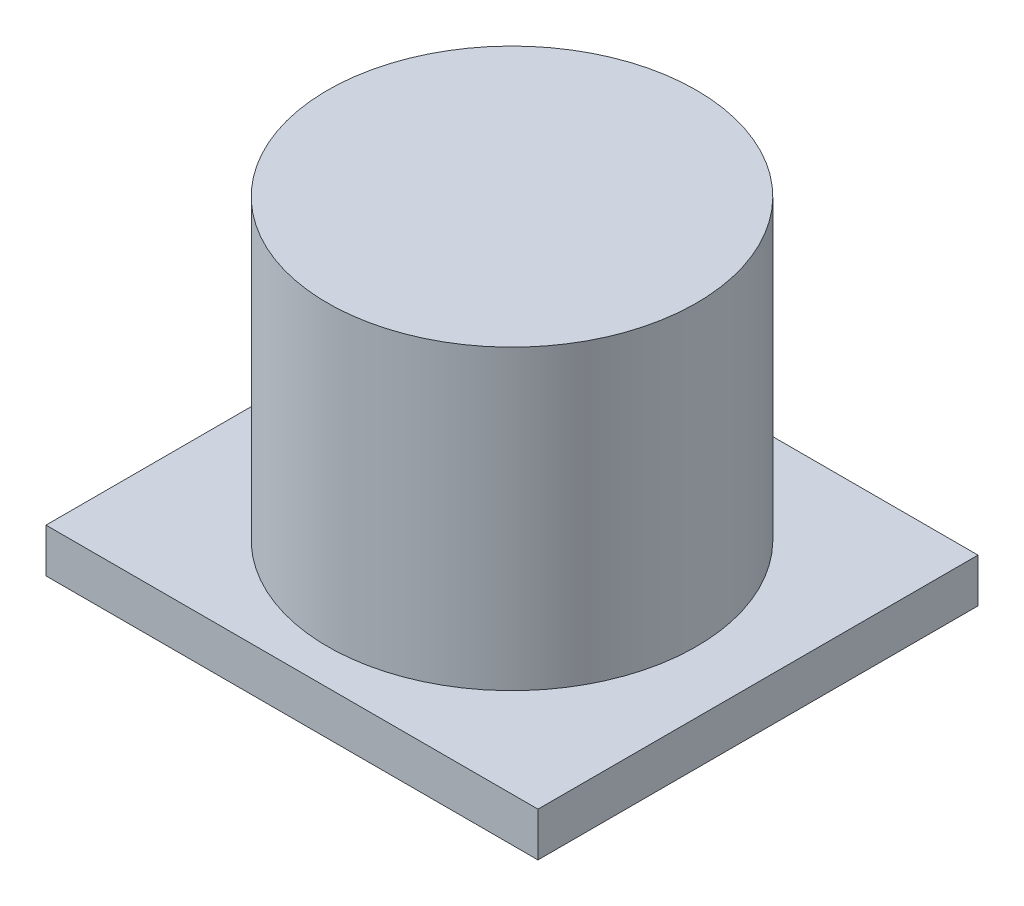
ISO-10303-21;
HEADER;
FILE_DESCRIPTION(('STEP AP214'),'2;1');
FILE_NAME('part.step','',(''),(''),'','','');
FILE_SCHEMA(('AUTOMOTIVE_DESIGN { 1 0 10303 214 1 1 1 1 }'));
ENDSEC;
DATA;
#1=APPLICATION_CONTEXT('core data for automotive mechanical design processes');
#2=APPLICATION_PROTOCOL_DEFINITION('international standard','automotive_design',2000,#1);
#3=PRODUCT_CONTEXT('',#1,'mechanical');
#4=PRODUCT('Part','Part','',(#3));
#5=PRODUCT_RELATED_PRODUCT_CATEGORY('part','',(#4));
#6=PRODUCT_DEFINITION_FORMATION('','',#4);
#7=PRODUCT_DEFINITION_CONTEXT('part definition',#1,'design');
#8=PRODUCT_DEFINITION('design','',#6,#7);
#9=PRODUCT_DEFINITION_SHAPE('','',#8);
#10=(LENGTH_UNIT() NAMED_UNIT(*) SI_UNIT(.MILLI.,.METRE.));
#11=(NAMED_UNIT(*) PLANE_ANGLE_UNIT() SI_UNIT($,.RADIAN.));
#12=(NAMED_UNIT(*) SI_UNIT($,.STERADIAN.) SOLID_ANGLE_UNIT());
#13=UNCERTAINTY_MEASURE_WITH_UNIT(LENGTH_MEASURE(1.E-05),#10,'distance_accuracy_value','');
#14=(GEOMETRIC_REPRESENTATION_CONTEXT(3) GLOBAL_UNCERTAINTY_ASSIGNED_CONTEXT((#13)) GLOBAL_UNIT_ASSIGNED_CONTEXT((#10,
#11,#12)) REPRESENTATION_CONTEXT('',''));
#15=CARTESIAN_POINT('',(0.,0.,0.));
#16=DIRECTION('',(0.,0.,1.));
#17=DIRECTION('',(1.,0.,0.));
#18=AXIS2_PLACEMENT_3D('',#15,#16,#17);
#19=CARTESIAN_POINT('',(0.,2.,0.));
#20=DIRECTION('',(0.,-1.,0.));
#21=DIRECTION('',(0.,0.,-1.));
#22=AXIS2_PLACEMENT_3D('',#19,#20,#21);
#23=PLANE('',#22);
#24=DIRECTION('',(0.,0.,-1.));
#25=VECTOR('',#24,1.);
#26=CARTESIAN_POINT('',(11.18,2.,10.));
#27=LINE('',#26,#25);
#28=CARTESIAN_POINT('',(11.18,2.,10.));
#29=VERTEX_POINT('',#28);
#30=CARTESIAN_POINT('',(11.18,2.,-10.));
#31=VERTEX_POINT('',#30);
#32=EDGE_CURVE('E86',#29,#31,#27,.T.);
#33=ORIENTED_EDGE('',*,*,#32,.T.);
#34=DIRECTION('',(-1.,0.,0.));
#35=VECTOR('',#34,1.);
#36=CARTESIAN_POINT('',(-11.18,2.,-10.));
#37=LINE('',#36,#35);
#38=CARTESIAN_POINT('',(-11.18,2.,-10.));
#39=VERTEX_POINT('',#38);
#40=EDGE_CURVE('E81',#31,#39,#37,.T.);
#41=ORIENTED_EDGE('',*,*,#40,.T.);
#42=DIRECTION('',(0.,0.,1.));
#43=VECTOR('',#42,1.);
#44=CARTESIAN_POINT('',(-11.18,2.,10.));
#45=LINE('',#44,#43);
#46=CARTESIAN_POINT('',(-11.18,2.,10.));
#47=VERTEX_POINT('',#46);
#48=EDGE_CURVE('E84',#39,#47,#45,.T.);
#49=ORIENTED_EDGE('',*,*,#48,.T.);
#50=DIRECTION('',(1.,0.,0.));
#51=VECTOR('',#50,1.);
#52=CARTESIAN_POINT('',(-11.18,2.,10.));
#53=LINE('',#52,#51);
#54=EDGE_CURVE('E50',#47,#29,#53,.T.);
#55=ORIENTED_EDGE('',*,*,#54,.T.);
#56=EDGE_LOOP('',(#33,#41,#49,#55));
#57=FACE_BOUND('',#56,.T.);
#58=CARTESIAN_POINT('',(0.,2.,0.));
#59=DIRECTION('',(0.,-1.,0.));
#60=DIRECTION('',(0.,0.,-1.));
#61=AXIS2_PLACEMENT_3D('',#58,#59,#60);
#62=CIRCLE('',#61,8.382);
#63=CARTESIAN_POINT('',(0.,2.,-8.382));
#64=VERTEX_POINT('',#63);
#65=EDGE_CURVE('E11',#64,#64,#62,.F.);
#66=ORIENTED_EDGE('',*,*,#65,.F.);
#67=EDGE_LOOP('',(#66));
#68=FACE_BOUND('',#67,.T.);
#69=ADVANCED_FACE('F33',(#57,#68),#23,.F.);
#70=CARTESIAN_POINT('',(11.18,2.,10.));
#71=DIRECTION('',(-1.,0.,0.));
#72=DIRECTION('',(0.,0.,1.));
#73=AXIS2_PLACEMENT_3D('',#70,#71,#72);
#74=PLANE('',#73);
#75=DIRECTION('',(0.,0.,-1.));
#76=VECTOR('',#75,1.);
#77=CARTESIAN_POINT('',(11.18,0.,10.));
#78=LINE('',#77,#76);
#79=CARTESIAN_POINT('',(11.18,0.,10.));
#80=VERTEX_POINT('',#79);
#81=CARTESIAN_POINT('',(11.18,0.,-10.));
#82=VERTEX_POINT('',#81);
#83=EDGE_CURVE('E100',#80,#82,#78,.T.);
#84=ORIENTED_EDGE('',*,*,#83,.T.);
#85=DIRECTION('',(0.,-1.,0.));
#86=VECTOR('',#85,1.);
#87=CARTESIAN_POINT('',(11.18,2.,-10.));
#88=LINE('',#87,#86);
#89=EDGE_CURVE('E42',#31,#82,#88,.T.);
#90=ORIENTED_EDGE('',*,*,#89,.F.);
#91=ORIENTED_EDGE('',*,*,#32,.F.);
#92=DIRECTION('',(0.,-1.,0.));
#93=VECTOR('',#92,1.);
#94=CARTESIAN_POINT('',(11.18,2.,10.));
#95=LINE('',#94,#93);
#96=EDGE_CURVE('E96',#29,#80,#95,.T.);
#97=ORIENTED_EDGE('',*,*,#96,.T.);
#98=EDGE_LOOP('',(#84,#90,#91,#97));
#99=FACE_BOUND('',#98,.T.);
#100=ADVANCED_FACE('F35',(#99),#74,.F.);
#101=CARTESIAN_POINT('',(-11.18,2.,-10.));
#102=DIRECTION('',(0.,0.,1.));
#103=DIRECTION('',(1.,0.,0.));
#104=AXIS2_PLACEMENT_3D('',#101,#102,#103);
#105=PLANE('',#104);
#106=DIRECTION('',(-1.,0.,0.));
#107=VECTOR('',#106,1.);
#108=CARTESIAN_POINT('',(-11.18,0.,-10.));
#109=LINE('',#108,#107);
#110=CARTESIAN_POINT('',(-11.18,0.,-10.));
#111=VERTEX_POINT('',#110);
#112=EDGE_CURVE('E91',#82,#111,#109,.T.);
#113=ORIENTED_EDGE('',*,*,#112,.T.);
#114=DIRECTION('',(0.,-1.,0.));
#115=VECTOR('',#114,1.);
#116=CARTESIAN_POINT('',(-11.18,2.,-10.));
#117=LINE('',#116,#115);
#118=EDGE_CURVE('E89',#39,#111,#117,.T.);
#119=ORIENTED_EDGE('',*,*,#118,.F.);
#120=ORIENTED_EDGE('',*,*,#40,.F.);
#121=ORIENTED_EDGE('',*,*,#89,.T.);
#122=EDGE_LOOP('',(#113,#119,#120,#121));
#123=FACE_BOUND('',#122,.T.);
#124=ADVANCED_FACE('F90',(#123),#105,.F.);
#125=CARTESIAN_POINT('',(-11.18,2.,10.));
#126=DIRECTION('',(1.,0.,0.));
#127=DIRECTION('',(0.,0.,-1.));
#128=AXIS2_PLACEMENT_3D('',#125,#126,#127);
#129=PLANE('',#128);
#130=DIRECTION('',(0.,0.,1.));
#131=VECTOR('',#130,1.);
#132=CARTESIAN_POINT('',(-11.18,0.,10.));
#133=LINE('',#132,#131);
#134=CARTESIAN_POINT('',(-11.18,0.,10.));
#135=VERTEX_POINT('',#134);
#136=EDGE_CURVE('E67',#111,#135,#133,.T.);
#137=ORIENTED_EDGE('',*,*,#136,.T.);
#138=DIRECTION('',(0.,-1.,0.));
#139=VECTOR('',#138,1.);
#140=CARTESIAN_POINT('',(-11.18,2.,10.));
#141=LINE('',#140,#139);
#142=EDGE_CURVE('E92',#47,#135,#141,.T.);
#143=ORIENTED_EDGE('',*,*,#142,.F.);
#144=ORIENTED_EDGE('',*,*,#48,.F.);
#145=ORIENTED_EDGE('',*,*,#118,.T.);
#146=EDGE_LOOP('',(#137,#143,#144,#145));
#147=FACE_BOUND('',#146,.T.);
#148=ADVANCED_FACE('F94',(#147),#129,.F.);
#149=CARTESIAN_POINT('',(-11.18,2.,10.));
#150=DIRECTION('',(0.,0.,-1.));
#151=DIRECTION('',(-1.,0.,0.));
#152=AXIS2_PLACEMENT_3D('',#149,#150,#151);
#153=PLANE('',#152);
#154=DIRECTION('',(1.,0.,0.));
#155=VECTOR('',#154,1.);
#156=CARTESIAN_POINT('',(-11.18,0.,10.));
#157=LINE('',#156,#155);
#158=EDGE_CURVE('E73',#135,#80,#157,.T.);
#159=ORIENTED_EDGE('',*,*,#158,.T.);
#160=ORIENTED_EDGE('',*,*,#96,.F.);
#161=ORIENTED_EDGE('',*,*,#54,.F.);
#162=ORIENTED_EDGE('',*,*,#142,.T.);
#163=EDGE_LOOP('',(#159,#160,#161,#162));
#164=FACE_BOUND('',#163,.T.);
#165=ADVANCED_FACE('F114',(#164),#153,.F.);
#166=CARTESIAN_POINT('',(0.,0.,0.));
#167=DIRECTION('',(0.,-1.,0.));
#168=DIRECTION('',(0.,0.,-1.));
#169=AXIS2_PLACEMENT_3D('',#166,#167,#168);
#170=PLANE('',#169);
#171=ORIENTED_EDGE('',*,*,#83,.F.);
#172=ORIENTED_EDGE('',*,*,#158,.F.);
#173=ORIENTED_EDGE('',*,*,#136,.F.);
#174=ORIENTED_EDGE('',*,*,#112,.F.);
#175=EDGE_LOOP('',(#171,#172,#173,#174));
#176=FACE_BOUND('',#175,.T.);
#177=ADVANCED_FACE('F111',(#176),#170,.T.);
#178=CARTESIAN_POINT('',(0.,15.52,0.));
#179=DIRECTION('',(0.,-1.,0.));
#180=DIRECTION('',(0.,0.,-1.));
#181=AXIS2_PLACEMENT_3D('',#178,#179,#180);
#182=CYLINDRICAL_SURFACE('',#181,8.382);
#183=CARTESIAN_POINT('',(0.,15.52,0.));
#184=DIRECTION('',(0.,1.,0.));
#185=DIRECTION('',(0.,0.,1.));
#186=AXIS2_PLACEMENT_3D('',#183,#184,#185);
#187=CIRCLE('',#186,8.382);
#188=CARTESIAN_POINT('',(0.,15.52,-8.382));
#189=VERTEX_POINT('',#188);
#190=EDGE_CURVE('E103',#189,#189,#187,.T.);
#191=CARTESIAN_POINT('',(0.,15.52,-8.382));
#192=CARTESIAN_POINT('',(0.,15.3791666666667,-8.382));
#193=CARTESIAN_POINT('',(0.,15.2383333333333,-8.382));
#194=CARTESIAN_POINT('',(0.,14.9566666666667,-8.382));
#195=CARTESIAN_POINT('',(0.,14.8158333333333,-8.382));
#196=CARTESIAN_POINT('',(0.,14.5341666666667,-8.382));
#197=CARTESIAN_POINT('',(0.,14.3933333333333,-8.382));
#198=CARTESIAN_POINT('',(0.,14.1116666666667,-8.382));
#199=CARTESIAN_POINT('',(0.,13.9708333333333,-8.382));
#200=CARTESIAN_POINT('',(0.,13.6891666666667,-8.382));
#201=CARTESIAN_POINT('',(0.,13.5483333333333,-8.382));
#202=CARTESIAN_POINT('',(0.,13.2666666666667,-8.382));
#203=CARTESIAN_POINT('',(0.,13.1258333333333,-8.382));
#204=CARTESIAN_POINT('',(0.,12.8441666666667,-8.382));
#205=CARTESIAN_POINT('',(0.,12.7033333333333,-8.382));
#206=CARTESIAN_POINT('',(0.,12.4216666666667,-8.382));
#207=CARTESIAN_POINT('',(0.,12.2808333333333,-8.382));
#208=CARTESIAN_POINT('',(0.,11.9991666666667,-8.382));
#209=CARTESIAN_POINT('',(0.,11.8583333333333,-8.382));
#210=CARTESIAN_POINT('',(0.,11.5766666666667,-8.382));
#211=CARTESIAN_POINT('',(0.,11.4358333333333,-8.382));
#212=CARTESIAN_POINT('',(0.,11.1541666666667,-8.382));
#213=CARTESIAN_POINT('',(0.,11.0133333333333,-8.382));
#214=CARTESIAN_POINT('',(0.,10.7316666666667,-8.382));
#215=CARTESIAN_POINT('',(0.,10.5908333333333,-8.382));
#216=CARTESIAN_POINT('',(0.,10.3091666666667,-8.382));
#217=CARTESIAN_POINT('',(0.,10.1683333333333,-8.382));
#218=CARTESIAN_POINT('',(0.,9.88666666666666,-8.382));
#219=CARTESIAN_POINT('',(0.,9.74583333333333,-8.382));
#220=CARTESIAN_POINT('',(0.,9.46416666666667,-8.382));
#221=CARTESIAN_POINT('',(0.,9.32333333333333,-8.382));
#222=CARTESIAN_POINT('',(0.,9.04166666666667,-8.382));
#223=CARTESIAN_POINT('',(0.,8.90083333333333,-8.382));
#224=CARTESIAN_POINT('',(0.,8.61916666666666,-8.382));
#225=CARTESIAN_POINT('',(0.,8.47833333333333,-8.382));
#226=CARTESIAN_POINT('',(0.,8.19666666666667,-8.382));
#227=CARTESIAN_POINT('',(0.,8.05583333333333,-8.382));
#228=CARTESIAN_POINT('',(0.,7.77416666666667,-8.382));
#229=CARTESIAN_POINT('',(0.,7.63333333333333,-8.382));
#230=CARTESIAN_POINT('',(0.,7.35166666666667,-8.382));
#231=CARTESIAN_POINT('',(0.,7.21083333333333,-8.382));
#232=CARTESIAN_POINT('',(0.,6.92916666666667,-8.382));
#233=CARTESIAN_POINT('',(0.,6.78833333333333,-8.382));
#234=CARTESIAN_POINT('',(0.,6.50666666666667,-8.382));
#235=CARTESIAN_POINT('',(0.,6.36583333333333,-8.382));
#236=CARTESIAN_POINT('',(0.,6.08416666666667,-8.382));
#237=CARTESIAN_POINT('',(0.,5.94333333333333,-8.382));
#238=CARTESIAN_POINT('',(0.,5.66166666666667,-8.382));
#239=CARTESIAN_POINT('',(0.,5.52083333333333,-8.382));
#240=CARTESIAN_POINT('',(0.,5.23916666666667,-8.382));
#241=CARTESIAN_POINT('',(0.,5.09833333333333,-8.382));
#242=CARTESIAN_POINT('',(0.,4.81666666666667,-8.382));
#243=CARTESIAN_POINT('',(0.,4.67583333333333,-8.382));
#244=CARTESIAN_POINT('',(0.,4.39416666666667,-8.382));
#245=CARTESIAN_POINT('',(0.,4.25333333333333,-8.382));
#246=CARTESIAN_POINT('',(0.,3.97166666666667,-8.382));
#247=CARTESIAN_POINT('',(0.,3.83083333333333,-8.382));
#248=CARTESIAN_POINT('',(0.,3.54916666666667,-8.382));
#249=CARTESIAN_POINT('',(0.,3.40833333333333,-8.382));
#250=CARTESIAN_POINT('',(0.,3.12666666666667,-8.382));
#251=CARTESIAN_POINT('',(0.,2.98583333333333,-8.382));
#252=CARTESIAN_POINT('',(0.,2.70416666666667,-8.382));
#253=CARTESIAN_POINT('',(0.,2.56333333333333,-8.382));
#254=CARTESIAN_POINT('',(0.,2.28166666666667,-8.382));
#255=CARTESIAN_POINT('',(0.,2.14083333333333,-8.382));
#256=CARTESIAN_POINT('',(0.,2.,-8.382));
#257=B_SPLINE_CURVE_WITH_KNOTS('',3,(#191,#192,#193,#194,#195,#196,#197,#198,#199,#200,#201,
#202,#203,#204,#205,#206,#207,#208,#209,#210,#211,#212,#213,#214,#215,#216,#217,#218,#219,#220,
#221,#222,#223,#224,#225,#226,#227,#228,#229,#230,#231,#232,#233,#234,#235,#236,#237,#238,#239,
#240,#241,#242,#243,#244,#245,#246,#247,#248,#249,#250,#251,#252,#253,#254,#255,#256),
.UNSPECIFIED.,.F.,.F.,(4,2,2,2,2,2,2,2,2,2,2,2,2,2,2,2,2,2,2,2,2,2,2,2,2,2,2,2,2,2,2,2,4),(0.,
0.422500000000001,0.845,1.2675,1.69,2.1125,2.535,2.9575,3.38,3.8025,4.225,4.6475,5.07,5.4925,
5.915,6.3375,6.76,7.1825,7.605,8.0275,8.45,8.8725,9.295,9.7175,10.14,10.5625,10.985,11.4075,
11.83,12.2525,12.675,13.0975,13.52),.UNSPECIFIED.);
#258=EDGE_CURVE('BSEAM113',#189,#64,#257,.T.);
#259=ORIENTED_EDGE('',*,*,#190,.F.);
#260=ORIENTED_EDGE('',*,*,#65,.T.);
#261=ORIENTED_EDGE('',*,*,#258,.T.);
#262=ORIENTED_EDGE('',*,*,#258,.F.);
#263=EDGE_LOOP('',(#259,#261,#260,#262));
#264=FACE_BOUND('',#263,.T.);
#265=ADVANCED_FACE('F113',(#264),#182,.T.);
#266=CARTESIAN_POINT('',(0.,15.52,0.));
#267=DIRECTION('',(0.,1.,0.));
#268=DIRECTION('',(0.,0.,1.));
#269=AXIS2_PLACEMENT_3D('',#266,#267,#268);
#270=PLANE('',#269);
#271=ORIENTED_EDGE('',*,*,#190,.T.);
#272=EDGE_LOOP('',(#271));
#273=FACE_BOUND('',#272,.T.);
#274=ADVANCED_FACE('F120',(#273),#270,.T.);
#275=CLOSED_SHELL('',(#69,#100,#124,#148,#165,#177,#265,#274));
#276=MANIFOLD_SOLID_BREP('B2',#275);
#277=ADVANCED_BREP_SHAPE_REPRESENTATION('',(#18,#276),#14);
#278=SHAPE_DEFINITION_REPRESENTATION(#9,#277);
ENDSEC;
END-ISO-10303-21;
